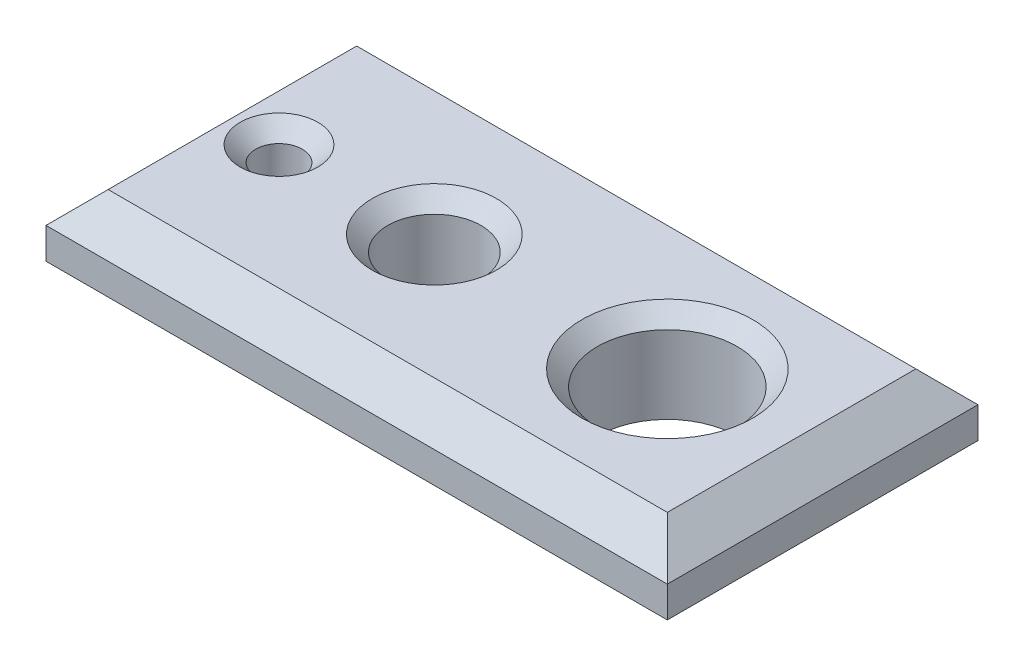
ISO-10303-21;
HEADER;
FILE_DESCRIPTION(('STEP AP214'),'2;1');
FILE_NAME('part.step','',(''),(''),'','','');
FILE_SCHEMA(('AUTOMOTIVE_DESIGN { 1 0 10303 214 1 1 1 1 }'));
ENDSEC;
DATA;
#1=APPLICATION_CONTEXT('core data for automotive mechanical design processes');
#2=APPLICATION_PROTOCOL_DEFINITION('international standard','automotive_design',2000,#1);
#3=PRODUCT_CONTEXT('',#1,'mechanical');
#4=PRODUCT('Part','Part','',(#3));
#5=PRODUCT_RELATED_PRODUCT_CATEGORY('part','',(#4));
#6=PRODUCT_DEFINITION_FORMATION('','',#4);
#7=PRODUCT_DEFINITION_CONTEXT('part definition',#1,'design');
#8=PRODUCT_DEFINITION('design','',#6,#7);
#9=PRODUCT_DEFINITION_SHAPE('','',#8);
#10=(LENGTH_UNIT() NAMED_UNIT(*) SI_UNIT(.MILLI.,.METRE.));
#11=(NAMED_UNIT(*) PLANE_ANGLE_UNIT() SI_UNIT($,.RADIAN.));
#12=(NAMED_UNIT(*) SI_UNIT($,.STERADIAN.) SOLID_ANGLE_UNIT());
#13=UNCERTAINTY_MEASURE_WITH_UNIT(LENGTH_MEASURE(1.E-05),#10,'distance_accuracy_value','');
#14=(GEOMETRIC_REPRESENTATION_CONTEXT(3) GLOBAL_UNCERTAINTY_ASSIGNED_CONTEXT((#13)) GLOBAL_UNIT_ASSIGNED_CONTEXT((#10,
#11,#12)) REPRESENTATION_CONTEXT('',''));
#15=CARTESIAN_POINT('',(0.,0.,0.));
#16=DIRECTION('',(0.,0.,1.));
#17=DIRECTION('',(1.,0.,0.));
#18=AXIS2_PLACEMENT_3D('',#15,#16,#17);
#19=CARTESIAN_POINT('',(0.,30.,-100.));
#20=DIRECTION('',(1.,0.,0.));
#21=DIRECTION('',(0.,0.,-1.));
#22=AXIS2_PLACEMENT_3D('',#19,#20,#21);
#23=PLANE('',#22);
#24=DIRECTION('',(0.,-1.,0.));
#25=VECTOR('',#24,1.);
#26=CARTESIAN_POINT('',(0.,30.,-100.));
#27=LINE('',#26,#25);
#28=CARTESIAN_POINT('',(0.,20.,-100.));
#29=VERTEX_POINT('',#28);
#30=CARTESIAN_POINT('',(0.,10.,-100.));
#31=VERTEX_POINT('',#30);
#32=EDGE_CURVE('E204',#29,#31,#27,.T.);
#33=ORIENTED_EDGE('',*,*,#32,.T.);
#34=DIRECTION('',(0.,0.,1.));
#35=VECTOR('',#34,1.);
#36=CARTESIAN_POINT('',(0.,10.,-100.));
#37=LINE('',#36,#35);
#38=CARTESIAN_POINT('',(0.,10.,0.));
#39=VERTEX_POINT('',#38);
#40=EDGE_CURVE('E11',#31,#39,#37,.T.);
#41=ORIENTED_EDGE('',*,*,#40,.T.);
#42=DIRECTION('',(0.,-1.,0.));
#43=VECTOR('',#42,1.);
#44=CARTESIAN_POINT('',(0.,30.,0.));
#45=LINE('',#44,#43);
#46=CARTESIAN_POINT('',(0.,20.,0.));
#47=VERTEX_POINT('',#46);
#48=EDGE_CURVE('E197',#47,#39,#45,.T.);
#49=ORIENTED_EDGE('',*,*,#48,.F.);
#50=DIRECTION('',(0.,0.,-1.));
#51=VECTOR('',#50,1.);
#52=CARTESIAN_POINT('',(0.,20.,-100.));
#53=LINE('',#52,#51);
#54=EDGE_CURVE('E120',#47,#29,#53,.T.);
#55=ORIENTED_EDGE('',*,*,#54,.T.);
#56=EDGE_LOOP('',(#33,#41,#49,#55));
#57=FACE_BOUND('',#56,.T.);
#58=ADVANCED_FACE('F35',(#57),#23,.F.);
#59=CARTESIAN_POINT('',(0.,30.,0.));
#60=DIRECTION('',(0.,0.,-1.));
#61=DIRECTION('',(-1.,0.,0.));
#62=AXIS2_PLACEMENT_3D('',#59,#60,#61);
#63=PLANE('',#62);
#64=ORIENTED_EDGE('',*,*,#48,.T.);
#65=DIRECTION('',(1.,0.,0.));
#66=VECTOR('',#65,1.);
#67=CARTESIAN_POINT('',(0.,10.,0.));
#68=LINE('',#67,#66);
#69=CARTESIAN_POINT('',(200.,10.,0.));
#70=VERTEX_POINT('',#69);
#71=EDGE_CURVE('E147',#39,#70,#68,.T.);
#72=ORIENTED_EDGE('',*,*,#71,.T.);
#73=DIRECTION('',(0.,-1.,0.));
#74=VECTOR('',#73,1.);
#75=CARTESIAN_POINT('',(200.,30.,0.));
#76=LINE('',#75,#74);
#77=CARTESIAN_POINT('',(200.,20.,0.));
#78=VERTEX_POINT('',#77);
#79=EDGE_CURVE('E195',#78,#70,#76,.T.);
#80=ORIENTED_EDGE('',*,*,#79,.F.);
#81=DIRECTION('',(-1.,0.,0.));
#82=VECTOR('',#81,1.);
#83=CARTESIAN_POINT('',(0.,20.,0.));
#84=LINE('',#83,#82);
#85=EDGE_CURVE('E145',#78,#47,#84,.T.);
#86=ORIENTED_EDGE('',*,*,#85,.T.);
#87=EDGE_LOOP('',(#64,#72,#80,#86));
#88=FACE_BOUND('',#87,.T.);
#89=ADVANCED_FACE('F194',(#88),#63,.F.);
#90=CARTESIAN_POINT('',(200.,30.,0.));
#91=DIRECTION('',(-1.,0.,0.));
#92=DIRECTION('',(0.,0.,1.));
#93=AXIS2_PLACEMENT_3D('',#90,#91,#92);
#94=PLANE('',#93);
#95=ORIENTED_EDGE('',*,*,#79,.T.);
#96=DIRECTION('',(0.,0.,-1.));
#97=VECTOR('',#96,1.);
#98=CARTESIAN_POINT('',(200.,10.,0.));
#99=LINE('',#98,#97);
#100=CARTESIAN_POINT('',(200.,10.,-100.));
#101=VERTEX_POINT('',#100);
#102=EDGE_CURVE('E59',#70,#101,#99,.T.);
#103=ORIENTED_EDGE('',*,*,#102,.T.);
#104=DIRECTION('',(0.,-1.,0.));
#105=VECTOR('',#104,1.);
#106=CARTESIAN_POINT('',(200.,30.,-100.));
#107=LINE('',#106,#105);
#108=CARTESIAN_POINT('',(200.,20.,-100.));
#109=VERTEX_POINT('',#108);
#110=EDGE_CURVE('E200',#109,#101,#107,.T.);
#111=ORIENTED_EDGE('',*,*,#110,.F.);
#112=DIRECTION('',(0.,0.,1.));
#113=VECTOR('',#112,1.);
#114=CARTESIAN_POINT('',(200.,20.,0.));
#115=LINE('',#114,#113);
#116=EDGE_CURVE('E139',#109,#78,#115,.T.);
#117=ORIENTED_EDGE('',*,*,#116,.T.);
#118=EDGE_LOOP('',(#95,#103,#111,#117));
#119=FACE_BOUND('',#118,.T.);
#120=ADVANCED_FACE('F198',(#119),#94,.F.);
#121=CARTESIAN_POINT('',(200.,30.,-100.));
#122=DIRECTION('',(0.,0.,1.));
#123=DIRECTION('',(1.,0.,0.));
#124=AXIS2_PLACEMENT_3D('',#121,#122,#123);
#125=PLANE('',#124);
#126=ORIENTED_EDGE('',*,*,#110,.T.);
#127=DIRECTION('',(-1.,0.,0.));
#128=VECTOR('',#127,1.);
#129=CARTESIAN_POINT('',(200.,10.,-100.));
#130=LINE('',#129,#128);
#131=EDGE_CURVE('E44',#101,#31,#130,.T.);
#132=ORIENTED_EDGE('',*,*,#131,.T.);
#133=ORIENTED_EDGE('',*,*,#32,.F.);
#134=DIRECTION('',(1.,0.,0.));
#135=VECTOR('',#134,1.);
#136=CARTESIAN_POINT('',(200.,20.,-100.));
#137=LINE('',#136,#135);
#138=EDGE_CURVE('E142',#29,#109,#137,.T.);
#139=ORIENTED_EDGE('',*,*,#138,.T.);
#140=EDGE_LOOP('',(#126,#132,#133,#139));
#141=FACE_BOUND('',#140,.T.);
#142=ADVANCED_FACE('F250',(#141),#125,.F.);
#143=CARTESIAN_POINT('',(0.,30.,0.));
#144=DIRECTION('',(0.,1.,0.));
#145=DIRECTION('',(0.,0.,1.));
#146=AXIS2_PLACEMENT_3D('',#143,#144,#145);
#147=PLANE('',#146);
#148=DIRECTION('',(1.,0.,0.));
#149=VECTOR('',#148,1.);
#150=CARTESIAN_POINT('',(200.,30.,-10.));
#151=LINE('',#150,#149);
#152=CARTESIAN_POINT('',(10.,30.,-10.));
#153=VERTEX_POINT('',#152);
#154=CARTESIAN_POINT('',(190.,30.,-10.));
#155=VERTEX_POINT('',#154);
#156=EDGE_CURVE('E108',#153,#155,#151,.T.);
#157=ORIENTED_EDGE('',*,*,#156,.T.);
#158=DIRECTION('',(0.,0.,-1.));
#159=VECTOR('',#158,1.);
#160=CARTESIAN_POINT('',(190.,30.,-100.));
#161=LINE('',#160,#159);
#162=CARTESIAN_POINT('',(190.,30.,-90.));
#163=VERTEX_POINT('',#162);
#164=EDGE_CURVE('E137',#155,#163,#161,.T.);
#165=ORIENTED_EDGE('',*,*,#164,.T.);
#166=DIRECTION('',(-1.,0.,0.));
#167=VECTOR('',#166,1.);
#168=CARTESIAN_POINT('',(0.,30.,-90.));
#169=LINE('',#168,#167);
#170=CARTESIAN_POINT('',(10.,30.,-90.));
#171=VERTEX_POINT('',#170);
#172=EDGE_CURVE('E111',#163,#171,#169,.T.);
#173=ORIENTED_EDGE('',*,*,#172,.T.);
#174=DIRECTION('',(0.,0.,1.));
#175=VECTOR('',#174,1.);
#176=CARTESIAN_POINT('',(10.,30.,0.));
#177=LINE('',#176,#175);
#178=EDGE_CURVE('E102',#171,#153,#177,.T.);
#179=ORIENTED_EDGE('',*,*,#178,.T.);
#180=EDGE_LOOP('',(#157,#165,#173,#179));
#181=FACE_BOUND('',#180,.T.);
#182=CARTESIAN_POINT('',(25.,30.,-50.));
#183=DIRECTION('',(0.,1.,0.));
#184=DIRECTION('',(0.,0.,1.));
#185=AXIS2_PLACEMENT_3D('',#182,#183,#184);
#186=CIRCLE('',#185,12.5);
#187=CARTESIAN_POINT('',(25.,30.,-37.5));
#188=VERTEX_POINT('',#187);
#189=EDGE_CURVE('E216',#188,#188,#186,.F.);
#190=ORIENTED_EDGE('',*,*,#189,.T.);
#191=EDGE_LOOP('',(#190));
#192=FACE_BOUND('',#191,.T.);
#193=CARTESIAN_POINT('',(75.,30.,-50.));
#194=DIRECTION('',(0.,1.,0.));
#195=DIRECTION('',(0.,0.,1.));
#196=AXIS2_PLACEMENT_3D('',#193,#194,#195);
#197=CIRCLE('',#196,20.);
#198=CARTESIAN_POINT('',(75.,30.,-30.));
#199=VERTEX_POINT('',#198);
#200=EDGE_CURVE('E213',#199,#199,#197,.F.);
#201=ORIENTED_EDGE('',*,*,#200,.T.);
#202=EDGE_LOOP('',(#201));
#203=FACE_BOUND('',#202,.T.);
#204=CARTESIAN_POINT('',(150.,30.,-50.));
#205=DIRECTION('',(0.,1.,0.));
#206=DIRECTION('',(0.,0.,1.));
#207=AXIS2_PLACEMENT_3D('',#204,#205,#206);
#208=CIRCLE('',#207,27.5000000000001);
#209=CARTESIAN_POINT('',(150.,30.,-22.5));
#210=VERTEX_POINT('',#209);
#211=EDGE_CURVE('E210',#210,#210,#208,.F.);
#212=ORIENTED_EDGE('',*,*,#211,.T.);
#213=EDGE_LOOP('',(#212));
#214=FACE_BOUND('',#213,.T.);
#215=ADVANCED_FACE('F104',(#181,#192,#203,#214),#147,.T.);
#216=CARTESIAN_POINT('',(0.,0.,0.));
#217=DIRECTION('',(0.,1.,0.));
#218=DIRECTION('',(0.,0.,1.));
#219=AXIS2_PLACEMENT_3D('',#216,#217,#218);
#220=PLANE('',#219);
#221=DIRECTION('',(0.,0.,1.));
#222=VECTOR('',#221,1.);
#223=CARTESIAN_POINT('',(190.,0.,0.));
#224=LINE('',#223,#222);
#225=CARTESIAN_POINT('',(190.,0.,-90.));
#226=VERTEX_POINT('',#225);
#227=CARTESIAN_POINT('',(190.,0.,-10.));
#228=VERTEX_POINT('',#227);
#229=EDGE_CURVE('E158',#226,#228,#224,.T.);
#230=ORIENTED_EDGE('',*,*,#229,.T.);
#231=DIRECTION('',(-1.,0.,0.));
#232=VECTOR('',#231,1.);
#233=CARTESIAN_POINT('',(0.,0.,-10.));
#234=LINE('',#233,#232);
#235=CARTESIAN_POINT('',(10.,0.,-10.));
#236=VERTEX_POINT('',#235);
#237=EDGE_CURVE('E160',#228,#236,#234,.T.);
#238=ORIENTED_EDGE('',*,*,#237,.T.);
#239=DIRECTION('',(0.,0.,-1.));
#240=VECTOR('',#239,1.);
#241=CARTESIAN_POINT('',(10.,0.,0.));
#242=LINE('',#241,#240);
#243=CARTESIAN_POINT('',(10.,0.,-90.));
#244=VERTEX_POINT('',#243);
#245=EDGE_CURVE('E154',#236,#244,#242,.T.);
#246=ORIENTED_EDGE('',*,*,#245,.T.);
#247=DIRECTION('',(1.,0.,0.));
#248=VECTOR('',#247,1.);
#249=CARTESIAN_POINT('',(0.,0.,-90.));
#250=LINE('',#249,#248);
#251=EDGE_CURVE('E156',#244,#226,#250,.T.);
#252=ORIENTED_EDGE('',*,*,#251,.T.);
#253=EDGE_LOOP('',(#230,#238,#246,#252));
#254=FACE_BOUND('',#253,.T.);
#255=CARTESIAN_POINT('',(25.,0.,-50.));
#256=DIRECTION('',(0.,1.,0.));
#257=DIRECTION('',(0.,0.,1.));
#258=AXIS2_PLACEMENT_3D('',#255,#256,#257);
#259=CIRCLE('',#258,7.5);
#260=CARTESIAN_POINT('',(25.,0.,-42.5));
#261=VERTEX_POINT('',#260);
#262=EDGE_CURVE('E271',#261,#261,#259,.T.);
#263=ORIENTED_EDGE('',*,*,#262,.T.);
#264=EDGE_LOOP('',(#263));
#265=FACE_BOUND('',#264,.T.);
#266=CARTESIAN_POINT('',(75.,0.,-50.));
#267=DIRECTION('',(0.,1.,0.));
#268=DIRECTION('',(0.,0.,1.));
#269=AXIS2_PLACEMENT_3D('',#266,#267,#268);
#270=CIRCLE('',#269,15.);
#271=CARTESIAN_POINT('',(75.,0.,-35.));
#272=VERTEX_POINT('',#271);
#273=EDGE_CURVE('E272',#272,#272,#270,.T.);
#274=ORIENTED_EDGE('',*,*,#273,.T.);
#275=EDGE_LOOP('',(#274));
#276=FACE_BOUND('',#275,.T.);
#277=CARTESIAN_POINT('',(150.,0.,-50.));
#278=DIRECTION('',(0.,1.,0.));
#279=DIRECTION('',(0.,0.,1.));
#280=AXIS2_PLACEMENT_3D('',#277,#278,#279);
#281=CIRCLE('',#280,22.5);
#282=CARTESIAN_POINT('',(150.,0.,-27.5));
#283=VERTEX_POINT('',#282);
#284=EDGE_CURVE('E123',#283,#283,#281,.T.);
#285=ORIENTED_EDGE('',*,*,#284,.T.);
#286=EDGE_LOOP('',(#285));
#287=FACE_BOUND('',#286,.T.);
#288=ADVANCED_FACE('F183',(#254,#265,#276,#287),#220,.F.);
#289=CARTESIAN_POINT('',(150.,0.,-50.));
#290=DIRECTION('',(0.,1.,0.));
#291=DIRECTION('',(0.,0.,1.));
#292=AXIS2_PLACEMENT_3D('',#289,#290,#291);
#293=CYLINDRICAL_SURFACE('',#292,22.5);
#294=CARTESIAN_POINT('',(150.,25.,-50.));
#295=DIRECTION('',(0.,1.,0.));
#296=DIRECTION('',(0.,0.,1.));
#297=AXIS2_PLACEMENT_3D('',#294,#295,#296);
#298=CIRCLE('',#297,22.5);
#299=CARTESIAN_POINT('',(150.,25.,-27.5));
#300=VERTEX_POINT('',#299);
#301=EDGE_CURVE('E129',#300,#300,#298,.T.);
#302=ORIENTED_EDGE('',*,*,#301,.T.);
#303=EDGE_LOOP('',(#302));
#304=FACE_BOUND('',#303,.T.);
#305=ORIENTED_EDGE('',*,*,#284,.F.);
#306=EDGE_LOOP('',(#305));
#307=FACE_BOUND('',#306,.T.);
#308=ADVANCED_FACE('F255',(#304,#307),#293,.F.);
#309=CARTESIAN_POINT('',(75.,0.,-50.));
#310=DIRECTION('',(0.,1.,0.));
#311=DIRECTION('',(0.,0.,1.));
#312=AXIS2_PLACEMENT_3D('',#309,#310,#311);
#313=CYLINDRICAL_SURFACE('',#312,15.);
#314=CARTESIAN_POINT('',(75.,25.,-50.));
#315=DIRECTION('',(0.,1.,0.));
#316=DIRECTION('',(0.,0.,1.));
#317=AXIS2_PLACEMENT_3D('',#314,#315,#316);
#318=CIRCLE('',#317,15.);
#319=CARTESIAN_POINT('',(75.,25.,-35.));
#320=VERTEX_POINT('',#319);
#321=EDGE_CURVE('E132',#320,#320,#318,.T.);
#322=ORIENTED_EDGE('',*,*,#321,.T.);
#323=EDGE_LOOP('',(#322));
#324=FACE_BOUND('',#323,.T.);
#325=ORIENTED_EDGE('',*,*,#273,.F.);
#326=EDGE_LOOP('',(#325));
#327=FACE_BOUND('',#326,.T.);
#328=ADVANCED_FACE('F221',(#324,#327),#313,.F.);
#329=CARTESIAN_POINT('',(25.,0.,-50.));
#330=DIRECTION('',(0.,1.,0.));
#331=DIRECTION('',(0.,0.,1.));
#332=AXIS2_PLACEMENT_3D('',#329,#330,#331);
#333=CYLINDRICAL_SURFACE('',#332,7.5);
#334=CARTESIAN_POINT('',(25.,25.,-50.));
#335=DIRECTION('',(0.,1.,0.));
#336=DIRECTION('',(0.,0.,1.));
#337=AXIS2_PLACEMENT_3D('',#334,#335,#336);
#338=CIRCLE('',#337,7.5);
#339=CARTESIAN_POINT('',(25.,25.,-42.5));
#340=VERTEX_POINT('',#339);
#341=EDGE_CURVE('E202',#340,#340,#338,.T.);
#342=ORIENTED_EDGE('',*,*,#341,.T.);
#343=EDGE_LOOP('',(#342));
#344=FACE_BOUND('',#343,.T.);
#345=ORIENTED_EDGE('',*,*,#262,.F.);
#346=EDGE_LOOP('',(#345));
#347=FACE_BOUND('',#346,.T.);
#348=ADVANCED_FACE('F236',(#344,#347),#333,.F.);
#349=CARTESIAN_POINT('',(25.,25.,-50.));
#350=DIRECTION('',(0.,1.,0.));
#351=DIRECTION('',(0.,0.,1.));
#352=AXIS2_PLACEMENT_3D('',#349,#350,#351);
#353=CONICAL_SURFACE('',#352,7.5,0.785398163397447);
#354=ORIENTED_EDGE('',*,*,#189,.F.);
#355=EDGE_LOOP('',(#354));
#356=FACE_BOUND('',#355,.T.);
#357=ORIENTED_EDGE('',*,*,#341,.F.);
#358=EDGE_LOOP('',(#357));
#359=FACE_BOUND('',#358,.T.);
#360=ADVANCED_FACE('F227',(#356,#359),#353,.F.);
#361=CARTESIAN_POINT('',(75.,25.,-50.));
#362=DIRECTION('',(0.,1.,0.));
#363=DIRECTION('',(0.,0.,1.));
#364=AXIS2_PLACEMENT_3D('',#361,#362,#363);
#365=CONICAL_SURFACE('',#364,15.,0.785398163397452);
#366=ORIENTED_EDGE('',*,*,#200,.F.);
#367=EDGE_LOOP('',(#366));
#368=FACE_BOUND('',#367,.T.);
#369=ORIENTED_EDGE('',*,*,#321,.F.);
#370=EDGE_LOOP('',(#369));
#371=FACE_BOUND('',#370,.T.);
#372=ADVANCED_FACE('F224',(#368,#371),#365,.F.);
#373=CARTESIAN_POINT('',(150.,25.,-50.));
#374=DIRECTION('',(0.,1.,0.));
#375=DIRECTION('',(0.,0.,1.));
#376=AXIS2_PLACEMENT_3D('',#373,#374,#375);
#377=CONICAL_SURFACE('',#376,22.5,0.785398163397451);
#378=ORIENTED_EDGE('',*,*,#211,.F.);
#379=EDGE_LOOP('',(#378));
#380=FACE_BOUND('',#379,.T.);
#381=ORIENTED_EDGE('',*,*,#301,.F.);
#382=EDGE_LOOP('',(#381));
#383=FACE_BOUND('',#382,.T.);
#384=ADVANCED_FACE('F226',(#380,#383),#377,.F.);
#385=CARTESIAN_POINT('',(10.,30.,0.));
#386=DIRECTION('',(-0.707106781186547,0.707106781186547,0.));
#387=DIRECTION('',(0.,0.,-1.));
#388=AXIS2_PLACEMENT_3D('',#385,#386,#387);
#389=PLANE('',#388);
#390=DIRECTION('',(-0.577350269189626,-0.577350269189626,-0.577350269189626));
#391=VECTOR('',#390,1.);
#392=CARTESIAN_POINT('',(40.,60.,-60.));
#393=LINE('',#392,#391);
#394=EDGE_CURVE('E124',#29,#171,#393,.F.);
#395=ORIENTED_EDGE('',*,*,#394,.F.);
#396=ORIENTED_EDGE('',*,*,#54,.F.);
#397=DIRECTION('',(-0.577350269189626,-0.577350269189626,0.577350269189626));
#398=VECTOR('',#397,1.);
#399=CARTESIAN_POINT('',(6.66666666666669,26.6666666666667,-6.66666666666669));
#400=LINE('',#399,#398);
#401=EDGE_CURVE('E118',#153,#47,#400,.T.);
#402=ORIENTED_EDGE('',*,*,#401,.F.);
#403=ORIENTED_EDGE('',*,*,#178,.F.);
#404=EDGE_LOOP('',(#395,#396,#402,#403));
#405=FACE_BOUND('',#404,.T.);
#406=ADVANCED_FACE('F119',(#405),#389,.T.);
#407=CARTESIAN_POINT('',(0.,30.,-10.));
#408=DIRECTION('',(0.,0.707106781186547,0.707106781186547));
#409=DIRECTION('',(-1.,0.,0.));
#410=AXIS2_PLACEMENT_3D('',#407,#408,#409);
#411=PLANE('',#410);
#412=ORIENTED_EDGE('',*,*,#401,.T.);
#413=ORIENTED_EDGE('',*,*,#85,.F.);
#414=DIRECTION('',(-0.577350269189626,0.577350269189626,-0.577350269189626));
#415=VECTOR('',#414,1.);
#416=CARTESIAN_POINT('',(126.666666666667,93.3333333333333,-73.3333333333334));
#417=LINE('',#416,#415);
#418=EDGE_CURVE('E127',#155,#78,#417,.F.);
#419=ORIENTED_EDGE('',*,*,#418,.F.);
#420=ORIENTED_EDGE('',*,*,#156,.F.);
#421=EDGE_LOOP('',(#412,#413,#419,#420));
#422=FACE_BOUND('',#421,.T.);
#423=ADVANCED_FACE('F126',(#422),#411,.T.);
#424=CARTESIAN_POINT('',(0.,30.,-90.));
#425=DIRECTION('',(0.,0.707106781186547,-0.707106781186547));
#426=DIRECTION('',(1.,0.,0.));
#427=AXIS2_PLACEMENT_3D('',#424,#425,#426);
#428=PLANE('',#427);
#429=ORIENTED_EDGE('',*,*,#394,.T.);
#430=ORIENTED_EDGE('',*,*,#172,.F.);
#431=DIRECTION('',(0.577350269189626,-0.577350269189626,-0.577350269189626));
#432=VECTOR('',#431,1.);
#433=CARTESIAN_POINT('',(126.666666666667,93.3333333333333,-26.6666666666666));
#434=LINE('',#433,#432);
#435=EDGE_CURVE('E148',#109,#163,#434,.F.);
#436=ORIENTED_EDGE('',*,*,#435,.F.);
#437=ORIENTED_EDGE('',*,*,#138,.F.);
#438=EDGE_LOOP('',(#429,#430,#436,#437));
#439=FACE_BOUND('',#438,.T.);
#440=ADVANCED_FACE('F286',(#439),#428,.T.);
#441=CARTESIAN_POINT('',(190.,30.,0.));
#442=DIRECTION('',(0.707106781186547,0.707106781186547,0.));
#443=DIRECTION('',(0.,0.,1.));
#444=AXIS2_PLACEMENT_3D('',#441,#442,#443);
#445=PLANE('',#444);
#446=ORIENTED_EDGE('',*,*,#418,.T.);
#447=ORIENTED_EDGE('',*,*,#116,.F.);
#448=ORIENTED_EDGE('',*,*,#435,.T.);
#449=ORIENTED_EDGE('',*,*,#164,.F.);
#450=EDGE_LOOP('',(#446,#447,#448,#449));
#451=FACE_BOUND('',#450,.T.);
#452=ADVANCED_FACE('F288',(#451),#445,.T.);
#453=CARTESIAN_POINT('',(200.,10.,-100.));
#454=DIRECTION('',(0.,0.707106781186547,0.707106781186547));
#455=DIRECTION('',(-1.,0.,0.));
#456=AXIS2_PLACEMENT_3D('',#453,#454,#455);
#457=PLANE('',#456);
#458=DIRECTION('',(-0.577350269189626,-0.577350269189626,0.577350269189626));
#459=VECTOR('',#458,1.);
#460=CARTESIAN_POINT('',(200.,10.,-100.));
#461=LINE('',#460,#459);
#462=EDGE_CURVE('E168',#226,#101,#461,.F.);
#463=ORIENTED_EDGE('',*,*,#462,.F.);
#464=ORIENTED_EDGE('',*,*,#251,.F.);
#465=DIRECTION('',(0.577350269189626,-0.577350269189626,0.577350269189626));
#466=VECTOR('',#465,1.);
#467=CARTESIAN_POINT('',(0.,10.,-100.));
#468=LINE('',#467,#466);
#469=EDGE_CURVE('E39',#31,#244,#468,.T.);
#470=ORIENTED_EDGE('',*,*,#469,.F.);
#471=ORIENTED_EDGE('',*,*,#131,.F.);
#472=EDGE_LOOP('',(#463,#464,#470,#471));
#473=FACE_BOUND('',#472,.T.);
#474=ADVANCED_FACE('F37',(#473),#457,.F.);
#475=CARTESIAN_POINT('',(0.,10.,-100.));
#476=DIRECTION('',(0.707106781186547,0.707106781186547,0.));
#477=DIRECTION('',(0.,0.,1.));
#478=AXIS2_PLACEMENT_3D('',#475,#476,#477);
#479=PLANE('',#478);
#480=ORIENTED_EDGE('',*,*,#469,.T.);
#481=ORIENTED_EDGE('',*,*,#245,.F.);
#482=DIRECTION('',(-0.577350269189626,0.577350269189626,0.577350269189626));
#483=VECTOR('',#482,1.);
#484=CARTESIAN_POINT('',(33.3333333333333,-23.3333333333333,-33.3333333333333));
#485=LINE('',#484,#483);
#486=EDGE_CURVE('E167',#39,#236,#485,.F.);
#487=ORIENTED_EDGE('',*,*,#486,.F.);
#488=ORIENTED_EDGE('',*,*,#40,.F.);
#489=EDGE_LOOP('',(#480,#481,#487,#488));
#490=FACE_BOUND('',#489,.T.);
#491=ADVANCED_FACE('F178',(#490),#479,.F.);
#492=CARTESIAN_POINT('',(200.,10.,0.));
#493=DIRECTION('',(-0.707106781186547,0.707106781186547,0.));
#494=DIRECTION('',(0.,0.,-1.));
#495=AXIS2_PLACEMENT_3D('',#492,#493,#494);
#496=PLANE('',#495);
#497=ORIENTED_EDGE('',*,*,#462,.T.);
#498=ORIENTED_EDGE('',*,*,#102,.F.);
#499=DIRECTION('',(-0.577350269189626,-0.577350269189626,-0.577350269189626));
#500=VECTOR('',#499,1.);
#501=CARTESIAN_POINT('',(200.,10.,0.));
#502=LINE('',#501,#500);
#503=EDGE_CURVE('E165',#228,#70,#502,.F.);
#504=ORIENTED_EDGE('',*,*,#503,.F.);
#505=ORIENTED_EDGE('',*,*,#229,.F.);
#506=EDGE_LOOP('',(#497,#498,#504,#505));
#507=FACE_BOUND('',#506,.T.);
#508=ADVANCED_FACE('F190',(#507),#496,.F.);
#509=CARTESIAN_POINT('',(0.,10.,0.));
#510=DIRECTION('',(0.,0.707106781186547,-0.707106781186547));
#511=DIRECTION('',(1.,0.,0.));
#512=AXIS2_PLACEMENT_3D('',#509,#510,#511);
#513=PLANE('',#512);
#514=ORIENTED_EDGE('',*,*,#486,.T.);
#515=ORIENTED_EDGE('',*,*,#237,.F.);
#516=ORIENTED_EDGE('',*,*,#503,.T.);
#517=ORIENTED_EDGE('',*,*,#71,.F.);
#518=EDGE_LOOP('',(#514,#515,#516,#517));
#519=FACE_BOUND('',#518,.T.);
#520=ADVANCED_FACE('F188',(#519),#513,.F.);
#521=CLOSED_SHELL('',(#58,#89,#120,#142,#215,#288,#308,#328,#348,#360,#372,#384,#406,#423,#440,
#452,#474,#491,#508,#520));
#522=MANIFOLD_SOLID_BREP('B2',#521);
#523=ADVANCED_BREP_SHAPE_REPRESENTATION('',(#18,#522),#14);
#524=SHAPE_DEFINITION_REPRESENTATION(#9,#523);
ENDSEC;
END-ISO-10303-21;
